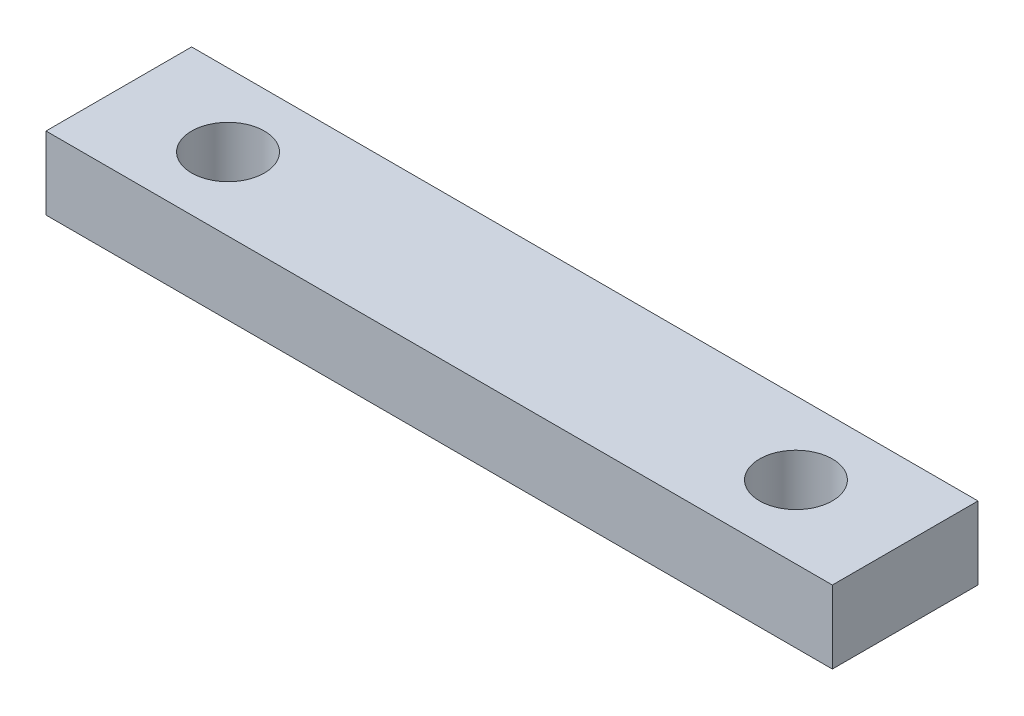
ISO-10303-21;
HEADER;
FILE_DESCRIPTION(('STEP AP214'),'2;1');
FILE_NAME('part.step','',(''),(''),'','','');
FILE_SCHEMA(('AUTOMOTIVE_DESIGN { 1 0 10303 214 1 1 1 1 }'));
ENDSEC;
DATA;
#1=APPLICATION_CONTEXT('core data for automotive mechanical design processes');
#2=APPLICATION_PROTOCOL_DEFINITION('international standard','automotive_design',2000,#1);
#3=PRODUCT_CONTEXT('',#1,'mechanical');
#4=PRODUCT('Part','Part','',(#3));
#5=PRODUCT_RELATED_PRODUCT_CATEGORY('part','',(#4));
#6=PRODUCT_DEFINITION_FORMATION('','',#4);
#7=PRODUCT_DEFINITION_CONTEXT('part definition',#1,'design');
#8=PRODUCT_DEFINITION('design','',#6,#7);
#9=PRODUCT_DEFINITION_SHAPE('','',#8);
#10=(LENGTH_UNIT() NAMED_UNIT(*) SI_UNIT(.MILLI.,.METRE.));
#11=(NAMED_UNIT(*) PLANE_ANGLE_UNIT() SI_UNIT($,.RADIAN.));
#12=(NAMED_UNIT(*) SI_UNIT($,.STERADIAN.) SOLID_ANGLE_UNIT());
#13=UNCERTAINTY_MEASURE_WITH_UNIT(LENGTH_MEASURE(1.E-05),#10,'distance_accuracy_value','');
#14=(GEOMETRIC_REPRESENTATION_CONTEXT(3) GLOBAL_UNCERTAINTY_ASSIGNED_CONTEXT((#13)) GLOBAL_UNIT_ASSIGNED_CONTEXT((#10,
#11,#12)) REPRESENTATION_CONTEXT('',''));
#15=CARTESIAN_POINT('',(0.,0.,0.));
#16=DIRECTION('',(0.,0.,1.));
#17=DIRECTION('',(1.,0.,0.));
#18=AXIS2_PLACEMENT_3D('',#15,#16,#17);
#19=CARTESIAN_POINT('',(27.,-2.5,-5.));
#20=DIRECTION('',(1.,0.,0.));
#21=DIRECTION('',(0.,0.,-1.));
#22=AXIS2_PLACEMENT_3D('',#19,#20,#21);
#23=PLANE('',#22);
#24=DIRECTION('',(0.,1.,0.));
#25=VECTOR('',#24,1.);
#26=CARTESIAN_POINT('',(27.,-2.5,-5.));
#27=LINE('',#26,#25);
#28=CARTESIAN_POINT('',(27.,-2.5,-5.));
#29=VERTEX_POINT('',#28);
#30=CARTESIAN_POINT('',(27.,2.5,-5.));
#31=VERTEX_POINT('',#30);
#32=EDGE_CURVE('E36',#29,#31,#27,.T.);
#33=ORIENTED_EDGE('',*,*,#32,.T.);
#34=DIRECTION('',(0.,0.,-1.));
#35=VECTOR('',#34,1.);
#36=CARTESIAN_POINT('',(27.,2.5,-5.));
#37=LINE('',#36,#35);
#38=CARTESIAN_POINT('',(27.,2.5,5.));
#39=VERTEX_POINT('',#38);
#40=EDGE_CURVE('E73',#39,#31,#37,.T.);
#41=ORIENTED_EDGE('',*,*,#40,.F.);
#42=DIRECTION('',(0.,1.,0.));
#43=VECTOR('',#42,1.);
#44=CARTESIAN_POINT('',(27.,-2.5,5.));
#45=LINE('',#44,#43);
#46=CARTESIAN_POINT('',(27.,-2.5,5.));
#47=VERTEX_POINT('',#46);
#48=EDGE_CURVE('E11',#47,#39,#45,.T.);
#49=ORIENTED_EDGE('',*,*,#48,.F.);
#50=DIRECTION('',(0.,0.,-1.));
#51=VECTOR('',#50,1.);
#52=CARTESIAN_POINT('',(27.,-2.5,-5.));
#53=LINE('',#52,#51);
#54=EDGE_CURVE('E74',#47,#29,#53,.T.);
#55=ORIENTED_EDGE('',*,*,#54,.T.);
#56=EDGE_LOOP('',(#33,#41,#49,#55));
#57=FACE_BOUND('',#56,.T.);
#58=ADVANCED_FACE('F33',(#57),#23,.T.);
#59=CARTESIAN_POINT('',(-27.,-2.5,5.));
#60=DIRECTION('',(0.,0.,1.));
#61=DIRECTION('',(1.,0.,0.));
#62=AXIS2_PLACEMENT_3D('',#59,#60,#61);
#63=PLANE('',#62);
#64=ORIENTED_EDGE('',*,*,#48,.T.);
#65=DIRECTION('',(1.,0.,0.));
#66=VECTOR('',#65,1.);
#67=CARTESIAN_POINT('',(-27.,2.5,5.));
#68=LINE('',#67,#66);
#69=CARTESIAN_POINT('',(-27.,2.5,5.));
#70=VERTEX_POINT('',#69);
#71=EDGE_CURVE('E91',#70,#39,#68,.T.);
#72=ORIENTED_EDGE('',*,*,#71,.F.);
#73=DIRECTION('',(0.,1.,0.));
#74=VECTOR('',#73,1.);
#75=CARTESIAN_POINT('',(-27.,-2.5,5.));
#76=LINE('',#75,#74);
#77=CARTESIAN_POINT('',(-27.,-2.5,5.));
#78=VERTEX_POINT('',#77);
#79=EDGE_CURVE('E41',#78,#70,#76,.T.);
#80=ORIENTED_EDGE('',*,*,#79,.F.);
#81=DIRECTION('',(1.,0.,0.));
#82=VECTOR('',#81,1.);
#83=CARTESIAN_POINT('',(-27.,-2.5,5.));
#84=LINE('',#83,#82);
#85=EDGE_CURVE('E79',#78,#47,#84,.T.);
#86=ORIENTED_EDGE('',*,*,#85,.T.);
#87=EDGE_LOOP('',(#64,#72,#80,#86));
#88=FACE_BOUND('',#87,.T.);
#89=ADVANCED_FACE('F117',(#88),#63,.T.);
#90=CARTESIAN_POINT('',(-27.,-2.5,-5.));
#91=DIRECTION('',(-1.,0.,0.));
#92=DIRECTION('',(0.,0.,1.));
#93=AXIS2_PLACEMENT_3D('',#90,#91,#92);
#94=PLANE('',#93);
#95=ORIENTED_EDGE('',*,*,#79,.T.);
#96=DIRECTION('',(0.,0.,1.));
#97=VECTOR('',#96,1.);
#98=CARTESIAN_POINT('',(-27.,2.5,-5.));
#99=LINE('',#98,#97);
#100=CARTESIAN_POINT('',(-27.,2.5,-5.));
#101=VERTEX_POINT('',#100);
#102=EDGE_CURVE('E86',#101,#70,#99,.T.);
#103=ORIENTED_EDGE('',*,*,#102,.F.);
#104=DIRECTION('',(0.,1.,0.));
#105=VECTOR('',#104,1.);
#106=CARTESIAN_POINT('',(-27.,-2.5,-5.));
#107=LINE('',#106,#105);
#108=CARTESIAN_POINT('',(-27.,-2.5,-5.));
#109=VERTEX_POINT('',#108);
#110=EDGE_CURVE('E78',#109,#101,#107,.T.);
#111=ORIENTED_EDGE('',*,*,#110,.F.);
#112=DIRECTION('',(0.,0.,1.));
#113=VECTOR('',#112,1.);
#114=CARTESIAN_POINT('',(-27.,-2.5,-5.));
#115=LINE('',#114,#113);
#116=EDGE_CURVE('E110',#109,#78,#115,.T.);
#117=ORIENTED_EDGE('',*,*,#116,.T.);
#118=EDGE_LOOP('',(#95,#103,#111,#117));
#119=FACE_BOUND('',#118,.T.);
#120=ADVANCED_FACE('F114',(#119),#94,.T.);
#121=CARTESIAN_POINT('',(-27.,-2.5,-5.));
#122=DIRECTION('',(0.,0.,-1.));
#123=DIRECTION('',(-1.,0.,0.));
#124=AXIS2_PLACEMENT_3D('',#121,#122,#123);
#125=PLANE('',#124);
#126=ORIENTED_EDGE('',*,*,#110,.T.);
#127=DIRECTION('',(-1.,0.,0.));
#128=VECTOR('',#127,1.);
#129=CARTESIAN_POINT('',(-27.,2.5,-5.));
#130=LINE('',#129,#128);
#131=EDGE_CURVE('E81',#31,#101,#130,.T.);
#132=ORIENTED_EDGE('',*,*,#131,.F.);
#133=ORIENTED_EDGE('',*,*,#32,.F.);
#134=DIRECTION('',(-1.,0.,0.));
#135=VECTOR('',#134,1.);
#136=CARTESIAN_POINT('',(-27.,-2.5,-5.));
#137=LINE('',#136,#135);
#138=EDGE_CURVE('E108',#29,#109,#137,.T.);
#139=ORIENTED_EDGE('',*,*,#138,.T.);
#140=EDGE_LOOP('',(#126,#132,#133,#139));
#141=FACE_BOUND('',#140,.T.);
#142=ADVANCED_FACE('F82',(#141),#125,.T.);
#143=CARTESIAN_POINT('',(0.,-2.5,0.));
#144=DIRECTION('',(0.,1.,0.));
#145=DIRECTION('',(0.,0.,1.));
#146=AXIS2_PLACEMENT_3D('',#143,#144,#145);
#147=PLANE('',#146);
#148=CARTESIAN_POINT('',(19.5,-2.5,0.));
#149=DIRECTION('',(0.,1.,0.));
#150=DIRECTION('',(0.,0.,1.));
#151=AXIS2_PLACEMENT_3D('',#148,#149,#150);
#152=CIRCLE('',#151,2.5);
#153=CARTESIAN_POINT('',(19.5,-2.5,2.5));
#154=VERTEX_POINT('',#153);
#155=EDGE_CURVE('E101',#154,#154,#152,.T.);
#156=ORIENTED_EDGE('',*,*,#155,.T.);
#157=EDGE_LOOP('',(#156));
#158=FACE_BOUND('',#157,.T.);
#159=CARTESIAN_POINT('',(-19.5,-2.5,0.));
#160=DIRECTION('',(0.,1.,0.));
#161=DIRECTION('',(0.,0.,1.));
#162=AXIS2_PLACEMENT_3D('',#159,#160,#161);
#163=CIRCLE('',#162,2.5);
#164=CARTESIAN_POINT('',(-19.5,-2.5,2.5));
#165=VERTEX_POINT('',#164);
#166=EDGE_CURVE('E104',#165,#165,#163,.T.);
#167=ORIENTED_EDGE('',*,*,#166,.T.);
#168=EDGE_LOOP('',(#167));
#169=FACE_BOUND('',#168,.T.);
#170=ORIENTED_EDGE('',*,*,#54,.F.);
#171=ORIENTED_EDGE('',*,*,#85,.F.);
#172=ORIENTED_EDGE('',*,*,#116,.F.);
#173=ORIENTED_EDGE('',*,*,#138,.F.);
#174=EDGE_LOOP('',(#170,#171,#172,#173));
#175=FACE_BOUND('',#174,.T.);
#176=ADVANCED_FACE('F119',(#158,#169,#175),#147,.F.);
#177=CARTESIAN_POINT('',(-19.5,-2.5,0.));
#178=DIRECTION('',(0.,1.,0.));
#179=DIRECTION('',(0.,0.,1.));
#180=AXIS2_PLACEMENT_3D('',#177,#178,#179);
#181=CYLINDRICAL_SURFACE('',#180,2.5);
#182=ORIENTED_EDGE('',*,*,#166,.F.);
#183=EDGE_LOOP('',(#182));
#184=FACE_BOUND('',#183,.T.);
#185=CARTESIAN_POINT('',(-19.5,2.5,0.));
#186=DIRECTION('',(0.,1.,0.));
#187=DIRECTION('',(0.,0.,1.));
#188=AXIS2_PLACEMENT_3D('',#185,#186,#187);
#189=CIRCLE('',#188,2.5);
#190=CARTESIAN_POINT('',(-19.5,2.5,2.5));
#191=VERTEX_POINT('',#190);
#192=EDGE_CURVE('E92',#191,#191,#189,.T.);
#193=ORIENTED_EDGE('',*,*,#192,.T.);
#194=EDGE_LOOP('',(#193));
#195=FACE_BOUND('',#194,.T.);
#196=ADVANCED_FACE('F121',(#184,#195),#181,.F.);
#197=CARTESIAN_POINT('',(19.5,-2.5,0.));
#198=DIRECTION('',(0.,1.,0.));
#199=DIRECTION('',(0.,0.,1.));
#200=AXIS2_PLACEMENT_3D('',#197,#198,#199);
#201=CYLINDRICAL_SURFACE('',#200,2.5);
#202=ORIENTED_EDGE('',*,*,#155,.F.);
#203=EDGE_LOOP('',(#202));
#204=FACE_BOUND('',#203,.T.);
#205=CARTESIAN_POINT('',(19.5,2.5,0.));
#206=DIRECTION('',(0.,1.,0.));
#207=DIRECTION('',(0.,0.,1.));
#208=AXIS2_PLACEMENT_3D('',#205,#206,#207);
#209=CIRCLE('',#208,2.5);
#210=CARTESIAN_POINT('',(19.5,2.5,2.5));
#211=VERTEX_POINT('',#210);
#212=EDGE_CURVE('E95',#211,#211,#209,.T.);
#213=ORIENTED_EDGE('',*,*,#212,.T.);
#214=EDGE_LOOP('',(#213));
#215=FACE_BOUND('',#214,.T.);
#216=ADVANCED_FACE('F128',(#204,#215),#201,.F.);
#217=CARTESIAN_POINT('',(0.,2.5,0.));
#218=DIRECTION('',(0.,1.,0.));
#219=DIRECTION('',(0.,0.,1.));
#220=AXIS2_PLACEMENT_3D('',#217,#218,#219);
#221=PLANE('',#220);
#222=ORIENTED_EDGE('',*,*,#192,.F.);
#223=EDGE_LOOP('',(#222));
#224=FACE_BOUND('',#223,.T.);
#225=ORIENTED_EDGE('',*,*,#40,.T.);
#226=ORIENTED_EDGE('',*,*,#131,.T.);
#227=ORIENTED_EDGE('',*,*,#102,.T.);
#228=ORIENTED_EDGE('',*,*,#71,.T.);
#229=EDGE_LOOP('',(#225,#226,#227,#228));
#230=FACE_BOUND('',#229,.T.);
#231=ORIENTED_EDGE('',*,*,#212,.F.);
#232=EDGE_LOOP('',(#231));
#233=FACE_BOUND('',#232,.T.);
#234=ADVANCED_FACE('F89',(#224,#230,#233),#221,.T.);
#235=CLOSED_SHELL('',(#58,#89,#120,#142,#176,#196,#216,#234));
#236=MANIFOLD_SOLID_BREP('B2',#235);
#237=ADVANCED_BREP_SHAPE_REPRESENTATION('',(#18,#236),#14);
#238=SHAPE_DEFINITION_REPRESENTATION(#9,#237);
ENDSEC;
END-ISO-10303-21;
